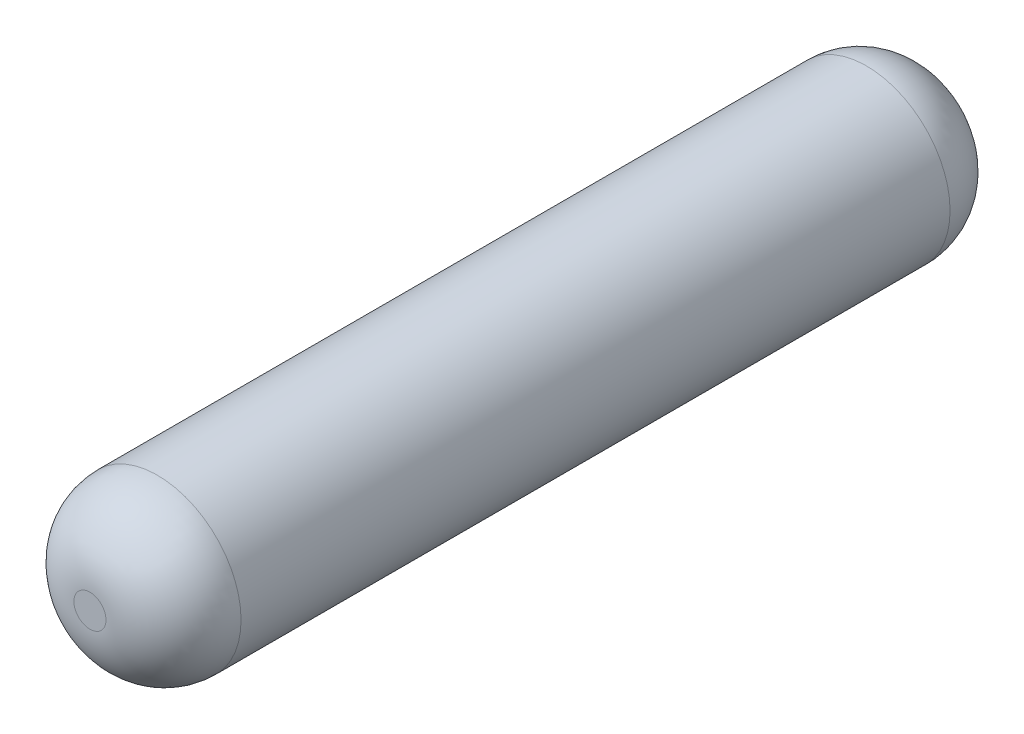
ISO-10303-21;
HEADER;
FILE_DESCRIPTION(('STEP AP214'),'2;1');
FILE_NAME('part.step','',(''),(''),'','','');
FILE_SCHEMA(('AUTOMOTIVE_DESIGN { 1 0 10303 214 1 1 1 1 }'));
ENDSEC;
DATA;
#1=APPLICATION_CONTEXT('core data for automotive mechanical design processes');
#2=APPLICATION_PROTOCOL_DEFINITION('international standard','automotive_design',2000,#1);
#3=PRODUCT_CONTEXT('',#1,'mechanical');
#4=PRODUCT('Part','Part','',(#3));
#5=PRODUCT_RELATED_PRODUCT_CATEGORY('part','',(#4));
#6=PRODUCT_DEFINITION_FORMATION('','',#4);
#7=PRODUCT_DEFINITION_CONTEXT('part definition',#1,'design');
#8=PRODUCT_DEFINITION('design','',#6,#7);
#9=PRODUCT_DEFINITION_SHAPE('','',#8);
#10=(LENGTH_UNIT() NAMED_UNIT(*) SI_UNIT(.MILLI.,.METRE.));
#11=(NAMED_UNIT(*) PLANE_ANGLE_UNIT() SI_UNIT($,.RADIAN.));
#12=(NAMED_UNIT(*) SI_UNIT($,.STERADIAN.) SOLID_ANGLE_UNIT());
#13=UNCERTAINTY_MEASURE_WITH_UNIT(LENGTH_MEASURE(1.E-05),#10,'distance_accuracy_value','');
#14=(GEOMETRIC_REPRESENTATION_CONTEXT(3) GLOBAL_UNCERTAINTY_ASSIGNED_CONTEXT((#13)) GLOBAL_UNIT_ASSIGNED_CONTEXT((#10,
#11,#12)) REPRESENTATION_CONTEXT('',''));
#15=CARTESIAN_POINT('',(0.,0.,0.));
#16=DIRECTION('',(0.,0.,1.));
#17=DIRECTION('',(1.,0.,0.));
#18=AXIS2_PLACEMENT_3D('',#15,#16,#17);
#19=CARTESIAN_POINT('',(0.,0.,25.));
#20=DIRECTION('',(0.,0.,-1.));
#21=DIRECTION('',(-1.,0.,0.));
#22=AXIS2_PLACEMENT_3D('',#19,#20,#21);
#23=CYLINDRICAL_SURFACE('',#22,2.475);
#24=CARTESIAN_POINT('',(0.,0.,2.));
#25=DIRECTION('',(0.,0.,1.));
#26=DIRECTION('',(1.,0.,0.));
#27=AXIS2_PLACEMENT_3D('',#24,#25,#26);
#28=CIRCLE('',#27,2.475);
#29=CARTESIAN_POINT('',(2.475,0.,2.));
#30=VERTEX_POINT('',#29);
#31=EDGE_CURVE('E48',#30,#30,#28,.T.);
#32=ORIENTED_EDGE('',*,*,#31,.T.);
#33=EDGE_LOOP('',(#32));
#34=FACE_BOUND('',#33,.T.);
#35=CARTESIAN_POINT('',(0.,0.,23.));
#36=DIRECTION('',(0.,0.,1.));
#37=DIRECTION('',(1.,0.,0.));
#38=AXIS2_PLACEMENT_3D('',#35,#36,#37);
#39=CIRCLE('',#38,2.475);
#40=CARTESIAN_POINT('',(2.475,0.,23.));
#41=VERTEX_POINT('',#40);
#42=EDGE_CURVE('E52',#41,#41,#39,.F.);
#43=ORIENTED_EDGE('',*,*,#42,.T.);
#44=EDGE_LOOP('',(#43));
#45=FACE_BOUND('',#44,.T.);
#46=ADVANCED_FACE('F37',(#34,#45),#23,.T.);
#47=CARTESIAN_POINT('',(0.,0.,25.));
#48=DIRECTION('',(0.,0.,1.));
#49=DIRECTION('',(1.,0.,0.));
#50=AXIS2_PLACEMENT_3D('',#47,#48,#49);
#51=PLANE('',#50);
#52=CARTESIAN_POINT('',(0.,0.,25.));
#53=DIRECTION('',(0.,0.,1.));
#54=DIRECTION('',(1.,0.,0.));
#55=AXIS2_PLACEMENT_3D('',#52,#53,#54);
#56=CIRCLE('',#55,0.475);
#57=CARTESIAN_POINT('',(0.475,0.,25.));
#58=VERTEX_POINT('',#57);
#59=EDGE_CURVE('E10',#58,#58,#56,.T.);
#60=ORIENTED_EDGE('',*,*,#59,.T.);
#61=EDGE_LOOP('',(#60));
#62=FACE_BOUND('',#61,.T.);
#63=ADVANCED_FACE('F68',(#62),#51,.T.);
#64=CARTESIAN_POINT('',(0.,0.,0.));
#65=DIRECTION('',(0.,0.,1.));
#66=DIRECTION('',(1.,0.,0.));
#67=AXIS2_PLACEMENT_3D('',#64,#65,#66);
#68=PLANE('',#67);
#69=CARTESIAN_POINT('',(0.,0.,0.));
#70=DIRECTION('',(0.,0.,1.));
#71=DIRECTION('',(1.,0.,0.));
#72=AXIS2_PLACEMENT_3D('',#69,#70,#71);
#73=CIRCLE('',#72,0.475);
#74=CARTESIAN_POINT('',(0.475,0.,0.));
#75=VERTEX_POINT('',#74);
#76=EDGE_CURVE('E44',#75,#75,#73,.F.);
#77=ORIENTED_EDGE('',*,*,#76,.T.);
#78=EDGE_LOOP('',(#77));
#79=FACE_BOUND('',#78,.T.);
#80=ADVANCED_FACE('F65',(#79),#68,.F.);
#81=CARTESIAN_POINT('',(0.,0.,2.));
#82=DIRECTION('',(0.,0.,1.));
#83=DIRECTION('',(1.,0.,0.));
#84=AXIS2_PLACEMENT_3D('',#81,#82,#83);
#85=DEGENERATE_TOROIDAL_SURFACE('',#84,0.475,2.,.T.);
#86=ORIENTED_EDGE('',*,*,#76,.F.);
#87=EDGE_LOOP('',(#86));
#88=FACE_BOUND('',#87,.T.);
#89=ORIENTED_EDGE('',*,*,#31,.F.);
#90=EDGE_LOOP('',(#89));
#91=FACE_BOUND('',#90,.T.);
#92=ADVANCED_FACE('F61',(#88,#91),#85,.T.);
#93=CARTESIAN_POINT('',(0.,0.,23.));
#94=DIRECTION('',(0.,0.,1.));
#95=DIRECTION('',(1.,0.,0.));
#96=AXIS2_PLACEMENT_3D('',#93,#94,#95);
#97=DEGENERATE_TOROIDAL_SURFACE('',#96,0.475,2.,.T.);
#98=ORIENTED_EDGE('',*,*,#42,.F.);
#99=EDGE_LOOP('',(#98));
#100=FACE_BOUND('',#99,.T.);
#101=ORIENTED_EDGE('',*,*,#59,.F.);
#102=EDGE_LOOP('',(#101));
#103=FACE_BOUND('',#102,.T.);
#104=ADVANCED_FACE('F39',(#100,#103),#97,.T.);
#105=CLOSED_SHELL('',(#46,#63,#80,#92,#104));
#106=MANIFOLD_SOLID_BREP('B2',#105);
#107=ADVANCED_BREP_SHAPE_REPRESENTATION('',(#18,#106),#14);
#108=SHAPE_DEFINITION_REPRESENTATION(#9,#107);
ENDSEC;
END-ISO-10303-21;
